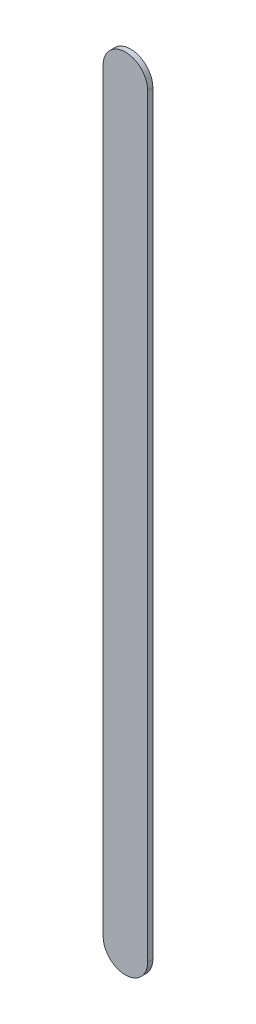
ISO-10303-21;
HEADER;
FILE_DESCRIPTION(('STEP AP214'),'2;1');
FILE_NAME('part.step','',(''),(''),'','','');
FILE_SCHEMA(('AUTOMOTIVE_DESIGN { 1 0 10303 214 1 1 1 1 }'));
ENDSEC;
DATA;
#1=APPLICATION_CONTEXT('core data for automotive mechanical design processes');
#2=APPLICATION_PROTOCOL_DEFINITION('international standard','automotive_design',2000,#1);
#3=PRODUCT_CONTEXT('',#1,'mechanical');
#4=PRODUCT('Part','Part','',(#3));
#5=PRODUCT_RELATED_PRODUCT_CATEGORY('part','',(#4));
#6=PRODUCT_DEFINITION_FORMATION('','',#4);
#7=PRODUCT_DEFINITION_CONTEXT('part definition',#1,'design');
#8=PRODUCT_DEFINITION('design','',#6,#7);
#9=PRODUCT_DEFINITION_SHAPE('','',#8);
#10=(LENGTH_UNIT() NAMED_UNIT(*) SI_UNIT(.MILLI.,.METRE.));
#11=(NAMED_UNIT(*) PLANE_ANGLE_UNIT() SI_UNIT($,.RADIAN.));
#12=(NAMED_UNIT(*) SI_UNIT($,.STERADIAN.) SOLID_ANGLE_UNIT());
#13=UNCERTAINTY_MEASURE_WITH_UNIT(LENGTH_MEASURE(1.E-05),#10,'distance_accuracy_value','');
#14=(GEOMETRIC_REPRESENTATION_CONTEXT(3) GLOBAL_UNCERTAINTY_ASSIGNED_CONTEXT((#13)) GLOBAL_UNIT_ASSIGNED_CONTEXT((#10,
#11,#12)) REPRESENTATION_CONTEXT('',''));
#15=CARTESIAN_POINT('',(0.,0.,0.));
#16=DIRECTION('',(0.,0.,1.));
#17=DIRECTION('',(1.,0.,0.));
#18=AXIS2_PLACEMENT_3D('',#15,#16,#17);
#19=CARTESIAN_POINT('',(79.86,-108.08,1.635));
#20=DIRECTION('',(0.,0.,1.));
#21=DIRECTION('',(1.,0.,0.));
#22=AXIS2_PLACEMENT_3D('',#19,#20,#21);
#23=PLANE('',#22);
#24=DIRECTION('',(0.,-1.,0.));
#25=VECTOR('',#24,1.);
#26=CARTESIAN_POINT('',(79.86,-108.08,1.635));
#27=LINE('',#26,#25);
#28=CARTESIAN_POINT('',(79.86,-108.08,1.635));
#29=VERTEX_POINT('',#28);
#30=CARTESIAN_POINT('',(79.86,-113.169999,1.635));
#31=VERTEX_POINT('',#30);
#32=EDGE_CURVE('E81',#29,#31,#27,.T.);
#33=ORIENTED_EDGE('',*,*,#32,.T.);
#34=CARTESIAN_POINT('',(80.01,-113.169999,1.635));
#35=DIRECTION('',(0.,0.,1.));
#36=DIRECTION('',(-1.,0.,0.));
#37=AXIS2_PLACEMENT_3D('',#34,#35,#36);
#38=CIRCLE('',#37,0.15);
#39=CARTESIAN_POINT('',(80.16,-113.169999,1.635));
#40=VERTEX_POINT('',#39);
#41=EDGE_CURVE('E104',#31,#40,#38,.T.);
#42=ORIENTED_EDGE('',*,*,#41,.T.);
#43=DIRECTION('',(0.,1.,0.));
#44=VECTOR('',#43,1.);
#45=CARTESIAN_POINT('',(80.16,-113.169999,1.635));
#46=LINE('',#45,#44);
#47=CARTESIAN_POINT('',(80.16,-108.08,1.635));
#48=VERTEX_POINT('',#47);
#49=EDGE_CURVE('E73',#40,#48,#46,.T.);
#50=ORIENTED_EDGE('',*,*,#49,.T.);
#51=CARTESIAN_POINT('',(80.01,-108.08,1.635));
#52=DIRECTION('',(0.,0.,1.));
#53=DIRECTION('',(1.,0.,0.));
#54=AXIS2_PLACEMENT_3D('',#51,#52,#53);
#55=CIRCLE('',#54,0.15);
#56=EDGE_CURVE('E11',#48,#29,#55,.T.);
#57=ORIENTED_EDGE('',*,*,#56,.T.);
#58=EDGE_LOOP('',(#33,#42,#50,#57));
#59=FACE_BOUND('',#58,.T.);
#60=ADVANCED_FACE('F17',(#59),#23,.T.);
#61=CARTESIAN_POINT('',(79.86,-108.08,1.6));
#62=DIRECTION('',(0.,0.,1.));
#63=DIRECTION('',(1.,0.,0.));
#64=AXIS2_PLACEMENT_3D('',#61,#62,#63);
#65=PLANE('',#64);
#66=CARTESIAN_POINT('',(80.01,-108.08,1.6));
#67=DIRECTION('',(0.,0.,1.));
#68=DIRECTION('',(1.,0.,0.));
#69=AXIS2_PLACEMENT_3D('',#66,#67,#68);
#70=CIRCLE('',#69,0.15);
#71=CARTESIAN_POINT('',(80.16,-108.08,1.6));
#72=VERTEX_POINT('',#71);
#73=CARTESIAN_POINT('',(79.86,-108.08,1.6));
#74=VERTEX_POINT('',#73);
#75=EDGE_CURVE('E27',#72,#74,#70,.T.);
#76=ORIENTED_EDGE('',*,*,#75,.F.);
#77=DIRECTION('',(0.,1.,0.));
#78=VECTOR('',#77,1.);
#79=CARTESIAN_POINT('',(80.16,-113.169999,1.6));
#80=LINE('',#79,#78);
#81=CARTESIAN_POINT('',(80.16,-113.169999,1.6));
#82=VERTEX_POINT('',#81);
#83=EDGE_CURVE('E108',#82,#72,#80,.T.);
#84=ORIENTED_EDGE('',*,*,#83,.F.);
#85=CARTESIAN_POINT('',(80.01,-113.169999,1.6));
#86=DIRECTION('',(0.,0.,1.));
#87=DIRECTION('',(-1.,0.,0.));
#88=AXIS2_PLACEMENT_3D('',#85,#86,#87);
#89=CIRCLE('',#88,0.15);
#90=CARTESIAN_POINT('',(79.86,-113.169999,1.6));
#91=VERTEX_POINT('',#90);
#92=EDGE_CURVE('E83',#91,#82,#89,.T.);
#93=ORIENTED_EDGE('',*,*,#92,.F.);
#94=DIRECTION('',(0.,-1.,0.));
#95=VECTOR('',#94,1.);
#96=CARTESIAN_POINT('',(79.86,-108.08,1.6));
#97=LINE('',#96,#95);
#98=EDGE_CURVE('E79',#74,#91,#97,.T.);
#99=ORIENTED_EDGE('',*,*,#98,.F.);
#100=EDGE_LOOP('',(#76,#84,#93,#99));
#101=FACE_BOUND('',#100,.T.);
#102=ADVANCED_FACE('F19',(#101),#65,.F.);
#103=CARTESIAN_POINT('',(80.01,-108.08,1.6));
#104=DIRECTION('',(0.,0.,-1.));
#105=DIRECTION('',(1.,0.,0.));
#106=AXIS2_PLACEMENT_3D('',#103,#104,#105);
#107=CYLINDRICAL_SURFACE('',#106,0.15);
#108=ORIENTED_EDGE('',*,*,#75,.T.);
#109=DIRECTION('',(0.,0.,1.));
#110=VECTOR('',#109,1.);
#111=CARTESIAN_POINT('',(79.86,-108.08,1.6));
#112=LINE('',#111,#110);
#113=EDGE_CURVE('E65',#74,#29,#112,.T.);
#114=ORIENTED_EDGE('',*,*,#113,.T.);
#115=ORIENTED_EDGE('',*,*,#56,.F.);
#116=DIRECTION('',(0.,0.,1.));
#117=VECTOR('',#116,1.);
#118=CARTESIAN_POINT('',(80.16,-108.08,1.6));
#119=LINE('',#118,#117);
#120=EDGE_CURVE('E68',#72,#48,#119,.T.);
#121=ORIENTED_EDGE('',*,*,#120,.F.);
#122=EDGE_LOOP('',(#108,#114,#115,#121));
#123=FACE_BOUND('',#122,.T.);
#124=ADVANCED_FACE('F64',(#123),#107,.T.);
#125=CARTESIAN_POINT('',(80.16,-113.169999,1.6));
#126=DIRECTION('',(-1.,0.,0.));
#127=DIRECTION('',(0.,0.,1.));
#128=AXIS2_PLACEMENT_3D('',#125,#126,#127);
#129=PLANE('',#128);
#130=ORIENTED_EDGE('',*,*,#83,.T.);
#131=ORIENTED_EDGE('',*,*,#120,.T.);
#132=ORIENTED_EDGE('',*,*,#49,.F.);
#133=DIRECTION('',(0.,0.,1.));
#134=VECTOR('',#133,1.);
#135=CARTESIAN_POINT('',(80.16,-113.169999,1.6));
#136=LINE('',#135,#134);
#137=EDGE_CURVE('E99',#82,#40,#136,.T.);
#138=ORIENTED_EDGE('',*,*,#137,.F.);
#139=EDGE_LOOP('',(#130,#131,#132,#138));
#140=FACE_BOUND('',#139,.T.);
#141=ADVANCED_FACE('F118',(#140),#129,.F.);
#142=CARTESIAN_POINT('',(80.01,-113.169999,1.6));
#143=DIRECTION('',(0.,0.,-1.));
#144=DIRECTION('',(-1.,0.,0.));
#145=AXIS2_PLACEMENT_3D('',#142,#143,#144);
#146=CYLINDRICAL_SURFACE('',#145,0.15);
#147=ORIENTED_EDGE('',*,*,#92,.T.);
#148=ORIENTED_EDGE('',*,*,#137,.T.);
#149=ORIENTED_EDGE('',*,*,#41,.F.);
#150=DIRECTION('',(0.,0.,1.));
#151=VECTOR('',#150,1.);
#152=CARTESIAN_POINT('',(79.86,-113.169999,1.6));
#153=LINE('',#152,#151);
#154=EDGE_CURVE('E88',#91,#31,#153,.T.);
#155=ORIENTED_EDGE('',*,*,#154,.F.);
#156=EDGE_LOOP('',(#147,#148,#149,#155));
#157=FACE_BOUND('',#156,.T.);
#158=ADVANCED_FACE('F120',(#157),#146,.T.);
#159=CARTESIAN_POINT('',(79.86,-108.08,1.6));
#160=DIRECTION('',(1.,0.,0.));
#161=DIRECTION('',(0.,1.,0.));
#162=AXIS2_PLACEMENT_3D('',#159,#160,#161);
#163=PLANE('',#162);
#164=ORIENTED_EDGE('',*,*,#98,.T.);
#165=ORIENTED_EDGE('',*,*,#154,.T.);
#166=ORIENTED_EDGE('',*,*,#32,.F.);
#167=ORIENTED_EDGE('',*,*,#113,.F.);
#168=EDGE_LOOP('',(#164,#165,#166,#167));
#169=FACE_BOUND('',#168,.T.);
#170=ADVANCED_FACE('F77',(#169),#163,.F.);
#171=CLOSED_SHELL('',(#60,#102,#124,#141,#158,#170));
#172=MANIFOLD_SOLID_BREP('B1',#171);
#173=ADVANCED_BREP_SHAPE_REPRESENTATION('',(#18,#172),#14);
#174=SHAPE_DEFINITION_REPRESENTATION(#9,#173);
ENDSEC;
END-ISO-10303-21;
